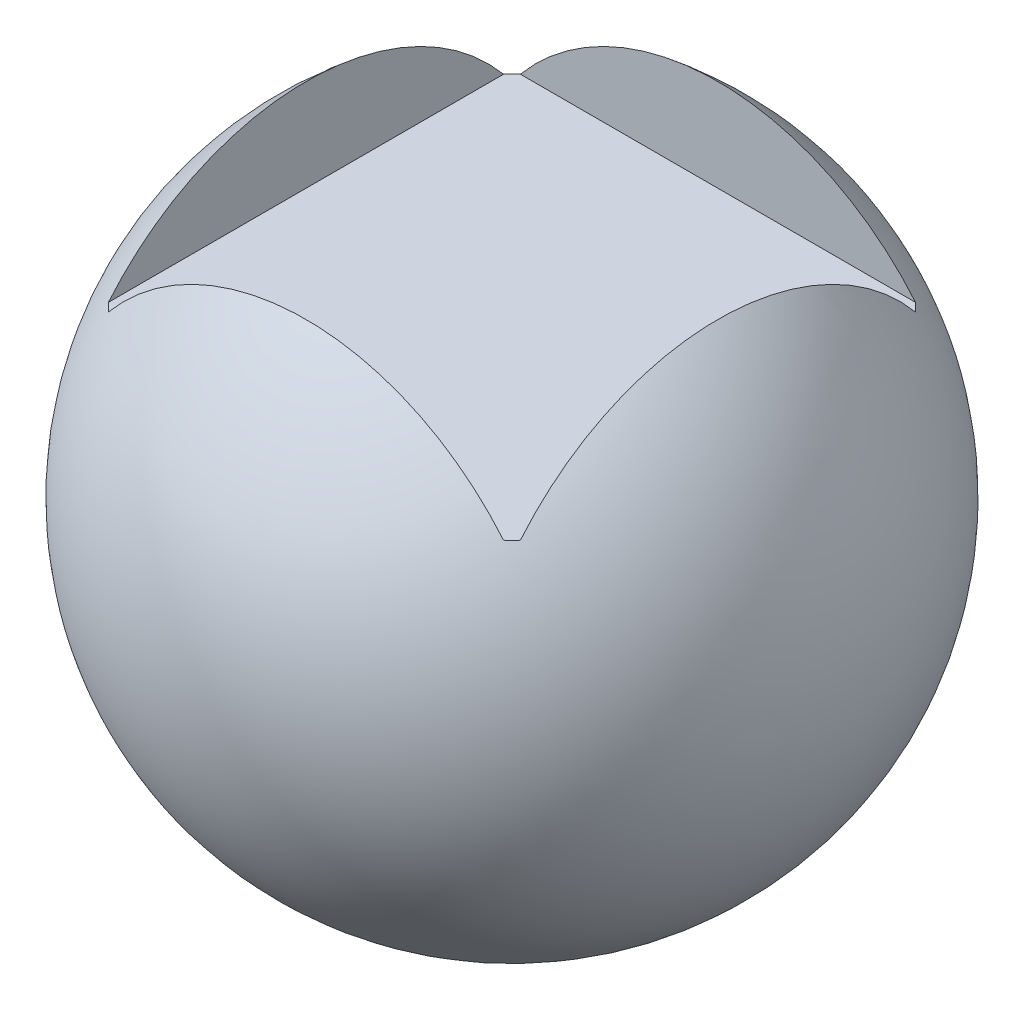
ISO-10303-21;
HEADER;
FILE_DESCRIPTION(('STEP AP214'),'2;1');
FILE_NAME('part.step','',(''),(''),'','','');
FILE_SCHEMA(('AUTOMOTIVE_DESIGN { 1 0 10303 214 1 1 1 1 }'));
ENDSEC;
DATA;
#1=APPLICATION_CONTEXT('core data for automotive mechanical design processes');
#2=APPLICATION_PROTOCOL_DEFINITION('international standard','automotive_design',2000,#1);
#3=PRODUCT_CONTEXT('',#1,'mechanical');
#4=PRODUCT('Part','Part','',(#3));
#5=PRODUCT_RELATED_PRODUCT_CATEGORY('part','',(#4));
#6=PRODUCT_DEFINITION_FORMATION('','',#4);
#7=PRODUCT_DEFINITION_CONTEXT('part definition',#1,'design');
#8=PRODUCT_DEFINITION('design','',#6,#7);
#9=PRODUCT_DEFINITION_SHAPE('','',#8);
#10=(LENGTH_UNIT() NAMED_UNIT(*) SI_UNIT(.MILLI.,.METRE.));
#11=(NAMED_UNIT(*) PLANE_ANGLE_UNIT() SI_UNIT($,.RADIAN.));
#12=(NAMED_UNIT(*) SI_UNIT($,.STERADIAN.) SOLID_ANGLE_UNIT());
#13=UNCERTAINTY_MEASURE_WITH_UNIT(LENGTH_MEASURE(1.E-05),#10,'distance_accuracy_value','');
#14=(GEOMETRIC_REPRESENTATION_CONTEXT(3) GLOBAL_UNCERTAINTY_ASSIGNED_CONTEXT((#13)) GLOBAL_UNIT_ASSIGNED_CONTEXT((#10,
#11,#12)) REPRESENTATION_CONTEXT('',''));
#15=CARTESIAN_POINT('',(0.,0.,0.));
#16=DIRECTION('',(0.,0.,1.));
#17=DIRECTION('',(1.,0.,0.));
#18=AXIS2_PLACEMENT_3D('',#15,#16,#17);
#19=CARTESIAN_POINT('',(0.,0.,0.));
#20=DIRECTION('',(0.,0.,-1.));
#21=DIRECTION('',(1.,0.,0.));
#22=AXIS2_PLACEMENT_3D('',#19,#20,#21);
#23=SPHERICAL_SURFACE('',#22,20.);
#24=CARTESIAN_POINT('',(-12.5,0.,0.));
#25=DIRECTION('',(1.,0.,0.));
#26=DIRECTION('',(0.,0.,-1.));
#27=AXIS2_PLACEMENT_3D('',#24,#25,#26);
#28=CIRCLE('',#27,15.612494995996);
#29=CARTESIAN_POINT('',(-12.5,10.,11.9895788082818));
#30=VERTEX_POINT('',#29);
#31=CARTESIAN_POINT('',(-12.5,10.,-11.9895788082818));
#32=VERTEX_POINT('',#31);
#33=EDGE_CURVE('E93',#30,#32,#28,.F.);
#34=ORIENTED_EDGE('',*,*,#33,.T.);
#35=CARTESIAN_POINT('',(0.,10.,0.));
#36=DIRECTION('',(0.,1.,0.));
#37=DIRECTION('',(0.,0.,1.));
#38=AXIS2_PLACEMENT_3D('',#35,#36,#37);
#39=CIRCLE('',#38,17.3205080756888);
#40=CARTESIAN_POINT('',(-11.9895788082818,10.,-12.5));
#41=VERTEX_POINT('',#40);
#42=EDGE_CURVE('E11',#32,#41,#39,.F.);
#43=ORIENTED_EDGE('',*,*,#42,.T.);
#44=CARTESIAN_POINT('',(0.,0.,-12.5));
#45=DIRECTION('',(0.,0.,1.));
#46=DIRECTION('',(1.,0.,0.));
#47=AXIS2_PLACEMENT_3D('',#44,#45,#46);
#48=CIRCLE('',#47,15.612494995996);
#49=CARTESIAN_POINT('',(11.9895788082818,10.,-12.5));
#50=VERTEX_POINT('',#49);
#51=EDGE_CURVE('E37',#41,#50,#48,.F.);
#52=ORIENTED_EDGE('',*,*,#51,.T.);
#53=CARTESIAN_POINT('',(12.5,10.,-11.9895788082818));
#54=VERTEX_POINT('',#53);
#55=EDGE_CURVE('E84',#50,#54,#39,.F.);
#56=ORIENTED_EDGE('',*,*,#55,.T.);
#57=CARTESIAN_POINT('',(12.5,0.,0.));
#58=DIRECTION('',(-1.,0.,0.));
#59=DIRECTION('',(0.,0.,1.));
#60=AXIS2_PLACEMENT_3D('',#57,#58,#59);
#61=CIRCLE('',#60,15.612494995996);
#62=CARTESIAN_POINT('',(12.5,10.,11.9895788082818));
#63=VERTEX_POINT('',#62);
#64=EDGE_CURVE('E87',#54,#63,#61,.F.);
#65=ORIENTED_EDGE('',*,*,#64,.T.);
#66=CARTESIAN_POINT('',(11.9895788082818,10.,12.5));
#67=VERTEX_POINT('',#66);
#68=EDGE_CURVE('E44',#63,#67,#39,.F.);
#69=ORIENTED_EDGE('',*,*,#68,.T.);
#70=CARTESIAN_POINT('',(0.,0.,12.5));
#71=DIRECTION('',(0.,0.,-1.));
#72=DIRECTION('',(-1.,0.,0.));
#73=AXIS2_PLACEMENT_3D('',#70,#71,#72);
#74=CIRCLE('',#73,15.612494995996);
#75=CARTESIAN_POINT('',(-11.9895788082818,10.,12.5));
#76=VERTEX_POINT('',#75);
#77=EDGE_CURVE('E83',#67,#76,#74,.F.);
#78=ORIENTED_EDGE('',*,*,#77,.T.);
#79=EDGE_CURVE('E43',#76,#30,#39,.F.);
#80=ORIENTED_EDGE('',*,*,#79,.T.);
#81=EDGE_LOOP('',(#34,#43,#52,#56,#65,#69,#78,#80));
#82=FACE_BOUND('',#81,.T.);
#83=ADVANCED_FACE('F34',(#82),#23,.T.);
#84=CARTESIAN_POINT('',(12.5,20.,-12.5));
#85=DIRECTION('',(-1.,0.,0.));
#86=DIRECTION('',(0.,0.,1.));
#87=AXIS2_PLACEMENT_3D('',#84,#85,#86);
#88=PLANE('',#87);
#89=DIRECTION('',(0.,0.,-1.));
#90=VECTOR('',#89,1.);
#91=CARTESIAN_POINT('',(12.5,10.,-12.5));
#92=LINE('',#91,#90);
#93=EDGE_CURVE('E78',#63,#54,#92,.T.);
#94=ORIENTED_EDGE('',*,*,#93,.F.);
#95=ORIENTED_EDGE('',*,*,#64,.F.);
#96=EDGE_LOOP('',(#94,#95));
#97=FACE_BOUND('',#96,.T.);
#98=ADVANCED_FACE('F86',(#97),#88,.T.);
#99=CARTESIAN_POINT('',(-12.5,20.,-12.5));
#100=DIRECTION('',(0.,0.,1.));
#101=DIRECTION('',(1.,0.,0.));
#102=AXIS2_PLACEMENT_3D('',#99,#100,#101);
#103=PLANE('',#102);
#104=DIRECTION('',(-1.,0.,0.));
#105=VECTOR('',#104,1.);
#106=CARTESIAN_POINT('',(-12.5,10.,-12.5));
#107=LINE('',#106,#105);
#108=EDGE_CURVE('E88',#50,#41,#107,.T.);
#109=ORIENTED_EDGE('',*,*,#108,.F.);
#110=ORIENTED_EDGE('',*,*,#51,.F.);
#111=EDGE_LOOP('',(#109,#110));
#112=FACE_BOUND('',#111,.T.);
#113=ADVANCED_FACE('F101',(#112),#103,.T.);
#114=CARTESIAN_POINT('',(-12.5,20.,-12.5));
#115=DIRECTION('',(1.,0.,0.));
#116=DIRECTION('',(0.,0.,-1.));
#117=AXIS2_PLACEMENT_3D('',#114,#115,#116);
#118=PLANE('',#117);
#119=DIRECTION('',(0.,0.,1.));
#120=VECTOR('',#119,1.);
#121=CARTESIAN_POINT('',(-12.5,10.,-12.5));
#122=LINE('',#121,#120);
#123=EDGE_CURVE('E97',#32,#30,#122,.T.);
#124=ORIENTED_EDGE('',*,*,#123,.F.);
#125=ORIENTED_EDGE('',*,*,#33,.F.);
#126=EDGE_LOOP('',(#124,#125));
#127=FACE_BOUND('',#126,.T.);
#128=ADVANCED_FACE('F103',(#127),#118,.T.);
#129=CARTESIAN_POINT('',(-12.5,20.,12.5));
#130=DIRECTION('',(0.,0.,-1.));
#131=DIRECTION('',(-1.,0.,0.));
#132=AXIS2_PLACEMENT_3D('',#129,#130,#131);
#133=PLANE('',#132);
#134=DIRECTION('',(1.,0.,0.));
#135=VECTOR('',#134,1.);
#136=CARTESIAN_POINT('',(-12.5,10.,12.5));
#137=LINE('',#136,#135);
#138=EDGE_CURVE('E51',#76,#67,#137,.T.);
#139=ORIENTED_EDGE('',*,*,#138,.F.);
#140=ORIENTED_EDGE('',*,*,#77,.F.);
#141=EDGE_LOOP('',(#139,#140));
#142=FACE_BOUND('',#141,.T.);
#143=ADVANCED_FACE('F109',(#142),#133,.T.);
#144=CARTESIAN_POINT('',(0.,10.,0.));
#145=DIRECTION('',(0.,1.,0.));
#146=DIRECTION('',(0.,0.,1.));
#147=AXIS2_PLACEMENT_3D('',#144,#145,#146);
#148=PLANE('',#147);
#149=ORIENTED_EDGE('',*,*,#138,.T.);
#150=ORIENTED_EDGE('',*,*,#68,.F.);
#151=ORIENTED_EDGE('',*,*,#93,.T.);
#152=ORIENTED_EDGE('',*,*,#55,.F.);
#153=ORIENTED_EDGE('',*,*,#108,.T.);
#154=ORIENTED_EDGE('',*,*,#42,.F.);
#155=ORIENTED_EDGE('',*,*,#123,.T.);
#156=ORIENTED_EDGE('',*,*,#79,.F.);
#157=EDGE_LOOP('',(#149,#150,#151,#152,#153,#154,#155,#156));
#158=FACE_BOUND('',#157,.T.);
#159=ADVANCED_FACE('F77',(#158),#148,.T.);
#160=CLOSED_SHELL('',(#83,#98,#113,#128,#143,#159));
#161=MANIFOLD_SOLID_BREP('B2',#160);
#162=ADVANCED_BREP_SHAPE_REPRESENTATION('',(#18,#161),#14);
#163=SHAPE_DEFINITION_REPRESENTATION(#9,#162);
ENDSEC;
END-ISO-10303-21;
